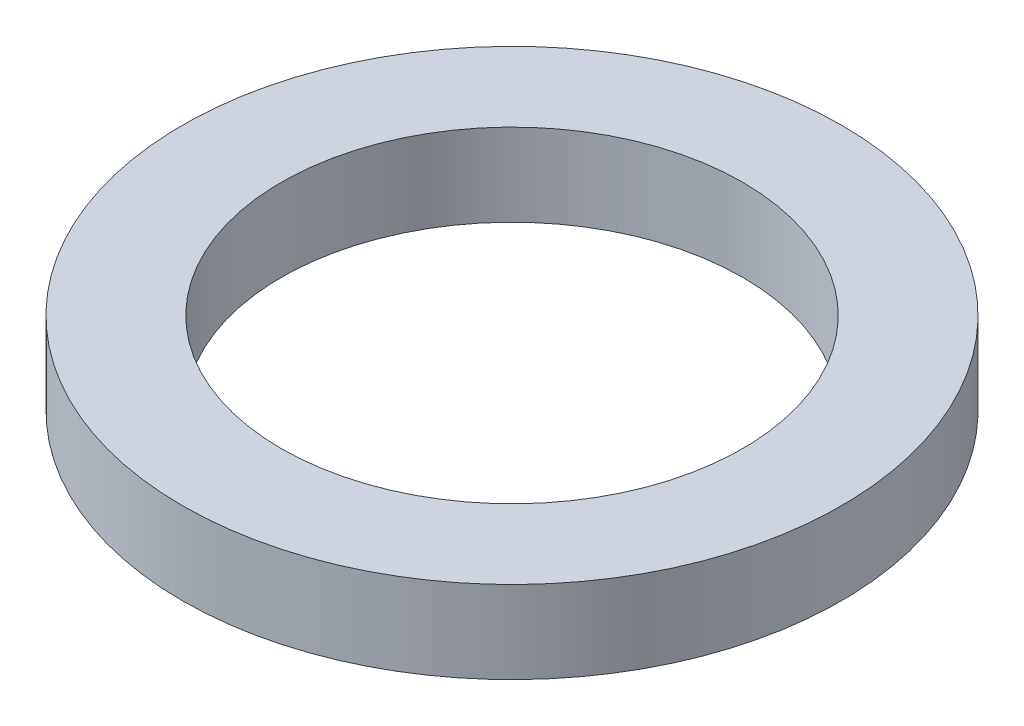
ISO-10303-21;
HEADER;
FILE_DESCRIPTION(('STEP AP214'),'2;1');
FILE_NAME('part.step','',(''),(''),'','','');
FILE_SCHEMA(('AUTOMOTIVE_DESIGN { 1 0 10303 214 1 1 1 1 }'));
ENDSEC;
DATA;
#1=APPLICATION_CONTEXT('core data for automotive mechanical design processes');
#2=APPLICATION_PROTOCOL_DEFINITION('international standard','automotive_design',2000,#1);
#3=PRODUCT_CONTEXT('',#1,'mechanical');
#4=PRODUCT('Part','Part','',(#3));
#5=PRODUCT_RELATED_PRODUCT_CATEGORY('part','',(#4));
#6=PRODUCT_DEFINITION_FORMATION('','',#4);
#7=PRODUCT_DEFINITION_CONTEXT('part definition',#1,'design');
#8=PRODUCT_DEFINITION('design','',#6,#7);
#9=PRODUCT_DEFINITION_SHAPE('','',#8);
#10=(LENGTH_UNIT() NAMED_UNIT(*) SI_UNIT(.MILLI.,.METRE.));
#11=(NAMED_UNIT(*) PLANE_ANGLE_UNIT() SI_UNIT($,.RADIAN.));
#12=(NAMED_UNIT(*) SI_UNIT($,.STERADIAN.) SOLID_ANGLE_UNIT());
#13=UNCERTAINTY_MEASURE_WITH_UNIT(LENGTH_MEASURE(1.E-05),#10,'distance_accuracy_value','');
#14=(GEOMETRIC_REPRESENTATION_CONTEXT(3) GLOBAL_UNCERTAINTY_ASSIGNED_CONTEXT((#13)) GLOBAL_UNIT_ASSIGNED_CONTEXT((#10,
#11,#12)) REPRESENTATION_CONTEXT('',''));
#15=CARTESIAN_POINT('',(0.,0.,0.));
#16=DIRECTION('',(0.,0.,1.));
#17=DIRECTION('',(1.,0.,0.));
#18=AXIS2_PLACEMENT_3D('',#15,#16,#17);
#19=CARTESIAN_POINT('',(0.,3.175,0.));
#20=DIRECTION('',(0.,1.,0.));
#21=DIRECTION('',(0.,0.,1.));
#22=AXIS2_PLACEMENT_3D('',#19,#20,#21);
#23=PLANE('',#22);
#24=CARTESIAN_POINT('',(0.,3.175,0.));
#25=DIRECTION('',(0.,1.,0.));
#26=DIRECTION('',(0.,0.,1.));
#27=AXIS2_PLACEMENT_3D('',#24,#25,#26);
#28=CIRCLE('',#27,12.7);
#29=CARTESIAN_POINT('',(0.,3.175,12.7));
#30=VERTEX_POINT('',#29);
#31=EDGE_CURVE('E10',#30,#30,#28,.T.);
#32=ORIENTED_EDGE('',*,*,#31,.T.);
#33=EDGE_LOOP('',(#32));
#34=FACE_BOUND('',#33,.T.);
#35=CARTESIAN_POINT('',(0.,3.175,0.));
#36=DIRECTION('',(0.,1.,0.));
#37=DIRECTION('',(0.,0.,1.));
#38=AXIS2_PLACEMENT_3D('',#35,#36,#37);
#39=CIRCLE('',#38,8.89);
#40=CARTESIAN_POINT('',(0.,3.175,8.89));
#41=VERTEX_POINT('',#40);
#42=EDGE_CURVE('E42',#41,#41,#39,.T.);
#43=ORIENTED_EDGE('',*,*,#42,.F.);
#44=EDGE_LOOP('',(#43));
#45=FACE_BOUND('',#44,.T.);
#46=ADVANCED_FACE('F31',(#34,#45),#23,.T.);
#47=CARTESIAN_POINT('',(0.,0.,0.));
#48=DIRECTION('',(0.,1.,0.));
#49=DIRECTION('',(0.,0.,1.));
#50=AXIS2_PLACEMENT_3D('',#47,#48,#49);
#51=PLANE('',#50);
#52=CARTESIAN_POINT('',(0.,0.,0.));
#53=DIRECTION('',(0.,1.,0.));
#54=DIRECTION('',(0.,0.,1.));
#55=AXIS2_PLACEMENT_3D('',#52,#53,#54);
#56=CIRCLE('',#55,12.7);
#57=CARTESIAN_POINT('',(0.,0.,12.7));
#58=VERTEX_POINT('',#57);
#59=EDGE_CURVE('E35',#58,#58,#56,.T.);
#60=ORIENTED_EDGE('',*,*,#59,.F.);
#61=EDGE_LOOP('',(#60));
#62=FACE_BOUND('',#61,.T.);
#63=CARTESIAN_POINT('',(0.,0.,0.));
#64=DIRECTION('',(0.,1.,0.));
#65=DIRECTION('',(0.,0.,1.));
#66=AXIS2_PLACEMENT_3D('',#63,#64,#65);
#67=CIRCLE('',#66,8.89);
#68=CARTESIAN_POINT('',(0.,0.,8.89));
#69=VERTEX_POINT('',#68);
#70=EDGE_CURVE('E44',#69,#69,#67,.T.);
#71=ORIENTED_EDGE('',*,*,#70,.T.);
#72=EDGE_LOOP('',(#71));
#73=FACE_BOUND('',#72,.T.);
#74=ADVANCED_FACE('F54',(#62,#73),#51,.F.);
#75=CARTESIAN_POINT('',(0.,3.175,0.));
#76=DIRECTION('',(0.,-1.,0.));
#77=DIRECTION('',(0.,0.,-1.));
#78=AXIS2_PLACEMENT_3D('',#75,#76,#77);
#79=CYLINDRICAL_SURFACE('',#78,12.7);
#80=ORIENTED_EDGE('',*,*,#31,.F.);
#81=EDGE_LOOP('',(#80));
#82=FACE_BOUND('',#81,.T.);
#83=ORIENTED_EDGE('',*,*,#59,.T.);
#84=EDGE_LOOP('',(#83));
#85=FACE_BOUND('',#84,.T.);
#86=ADVANCED_FACE('F33',(#82,#85),#79,.T.);
#87=CARTESIAN_POINT('',(0.,3.175,0.));
#88=DIRECTION('',(0.,-1.,0.));
#89=DIRECTION('',(0.,0.,-1.));
#90=AXIS2_PLACEMENT_3D('',#87,#88,#89);
#91=CYLINDRICAL_SURFACE('',#90,8.89);
#92=ORIENTED_EDGE('',*,*,#42,.T.);
#93=EDGE_LOOP('',(#92));
#94=FACE_BOUND('',#93,.T.);
#95=ORIENTED_EDGE('',*,*,#70,.F.);
#96=EDGE_LOOP('',(#95));
#97=FACE_BOUND('',#96,.T.);
#98=ADVANCED_FACE('F50',(#94,#97),#91,.F.);
#99=CLOSED_SHELL('',(#46,#74,#86,#98));
#100=MANIFOLD_SOLID_BREP('B2',#99);
#101=ADVANCED_BREP_SHAPE_REPRESENTATION('',(#18,#100),#14);
#102=SHAPE_DEFINITION_REPRESENTATION(#9,#101);
ENDSEC;
END-ISO-10303-21;
